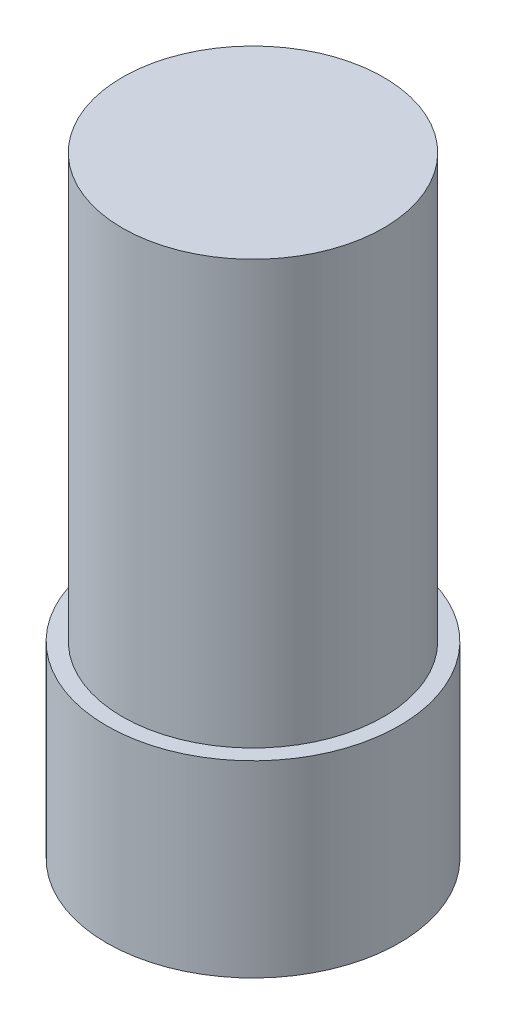
ISO-10303-21;
HEADER;
FILE_DESCRIPTION(('STEP AP214'),'2;1');
FILE_NAME('part.step','',(''),(''),'','','');
FILE_SCHEMA(('AUTOMOTIVE_DESIGN { 1 0 10303 214 1 1 1 1 }'));
ENDSEC;
DATA;
#1=APPLICATION_CONTEXT('core data for automotive mechanical design processes');
#2=APPLICATION_PROTOCOL_DEFINITION('international standard','automotive_design',2000,#1);
#3=PRODUCT_CONTEXT('',#1,'mechanical');
#4=PRODUCT('Part','Part','',(#3));
#5=PRODUCT_RELATED_PRODUCT_CATEGORY('part','',(#4));
#6=PRODUCT_DEFINITION_FORMATION('','',#4);
#7=PRODUCT_DEFINITION_CONTEXT('part definition',#1,'design');
#8=PRODUCT_DEFINITION('design','',#6,#7);
#9=PRODUCT_DEFINITION_SHAPE('','',#8);
#10=(LENGTH_UNIT() NAMED_UNIT(*) SI_UNIT(.MILLI.,.METRE.));
#11=(NAMED_UNIT(*) PLANE_ANGLE_UNIT() SI_UNIT($,.RADIAN.));
#12=(NAMED_UNIT(*) SI_UNIT($,.STERADIAN.) SOLID_ANGLE_UNIT());
#13=UNCERTAINTY_MEASURE_WITH_UNIT(LENGTH_MEASURE(1.E-05),#10,'distance_accuracy_value','');
#14=(GEOMETRIC_REPRESENTATION_CONTEXT(3) GLOBAL_UNCERTAINTY_ASSIGNED_CONTEXT((#13)) GLOBAL_UNIT_ASSIGNED_CONTEXT((#10,
#11,#12)) REPRESENTATION_CONTEXT('',''));
#15=CARTESIAN_POINT('',(0.,0.,0.));
#16=DIRECTION('',(0.,0.,1.));
#17=DIRECTION('',(1.,0.,0.));
#18=AXIS2_PLACEMENT_3D('',#15,#16,#17);
#19=CARTESIAN_POINT('',(0.,18.,0.));
#20=DIRECTION('',(0.,-1.,0.));
#21=DIRECTION('',(0.,0.,-1.));
#22=AXIS2_PLACEMENT_3D('',#19,#20,#21);
#23=CYLINDRICAL_SURFACE('',#22,14.);
#24=CARTESIAN_POINT('',(0.,18.,0.));
#25=DIRECTION('',(0.,1.,0.));
#26=DIRECTION('',(0.,0.,1.));
#27=AXIS2_PLACEMENT_3D('',#24,#25,#26);
#28=CIRCLE('',#27,14.);
#29=CARTESIAN_POINT('',(0.,18.,14.));
#30=VERTEX_POINT('',#29);
#31=EDGE_CURVE('E42',#30,#30,#28,.T.);
#32=ORIENTED_EDGE('',*,*,#31,.F.);
#33=EDGE_LOOP('',(#32));
#34=FACE_BOUND('',#33,.T.);
#35=CARTESIAN_POINT('',(0.,0.,0.));
#36=DIRECTION('',(0.,1.,0.));
#37=DIRECTION('',(0.,0.,1.));
#38=AXIS2_PLACEMENT_3D('',#35,#36,#37);
#39=CIRCLE('',#38,14.);
#40=CARTESIAN_POINT('',(0.,0.,14.));
#41=VERTEX_POINT('',#40);
#42=EDGE_CURVE('E38',#41,#41,#39,.T.);
#43=ORIENTED_EDGE('',*,*,#42,.T.);
#44=EDGE_LOOP('',(#43));
#45=FACE_BOUND('',#44,.T.);
#46=ADVANCED_FACE('F35',(#34,#45),#23,.T.);
#47=CARTESIAN_POINT('',(0.,18.,0.));
#48=DIRECTION('',(0.,1.,0.));
#49=DIRECTION('',(0.,0.,1.));
#50=AXIS2_PLACEMENT_3D('',#47,#48,#49);
#51=PLANE('',#50);
#52=CARTESIAN_POINT('',(0.,18.,0.));
#53=DIRECTION('',(0.,1.,0.));
#54=DIRECTION('',(0.,0.,1.));
#55=AXIS2_PLACEMENT_3D('',#52,#53,#54);
#56=CIRCLE('',#55,12.5);
#57=CARTESIAN_POINT('',(0.,18.,12.5));
#58=VERTEX_POINT('',#57);
#59=EDGE_CURVE('E10',#58,#58,#56,.T.);
#60=ORIENTED_EDGE('',*,*,#59,.F.);
#61=EDGE_LOOP('',(#60));
#62=FACE_BOUND('',#61,.T.);
#63=ORIENTED_EDGE('',*,*,#31,.T.);
#64=EDGE_LOOP('',(#63));
#65=FACE_BOUND('',#64,.T.);
#66=ADVANCED_FACE('F59',(#62,#65),#51,.T.);
#67=CARTESIAN_POINT('',(0.,0.,0.));
#68=DIRECTION('',(0.,1.,0.));
#69=DIRECTION('',(0.,0.,1.));
#70=AXIS2_PLACEMENT_3D('',#67,#68,#69);
#71=PLANE('',#70);
#72=ORIENTED_EDGE('',*,*,#42,.F.);
#73=EDGE_LOOP('',(#72));
#74=FACE_BOUND('',#73,.T.);
#75=ADVANCED_FACE('F56',(#74),#71,.F.);
#76=CARTESIAN_POINT('',(0.,58.5,0.));
#77=DIRECTION('',(0.,-1.,0.));
#78=DIRECTION('',(0.,0.,-1.));
#79=AXIS2_PLACEMENT_3D('',#76,#77,#78);
#80=CYLINDRICAL_SURFACE('',#79,12.5);
#81=CARTESIAN_POINT('',(0.,58.5,0.));
#82=DIRECTION('',(0.,1.,0.));
#83=DIRECTION('',(0.,0.,1.));
#84=AXIS2_PLACEMENT_3D('',#81,#82,#83);
#85=CIRCLE('',#84,12.5);
#86=CARTESIAN_POINT('',(0.,58.5,12.5));
#87=VERTEX_POINT('',#86);
#88=EDGE_CURVE('E48',#87,#87,#85,.T.);
#89=ORIENTED_EDGE('',*,*,#88,.F.);
#90=EDGE_LOOP('',(#89));
#91=FACE_BOUND('',#90,.T.);
#92=ORIENTED_EDGE('',*,*,#59,.T.);
#93=EDGE_LOOP('',(#92));
#94=FACE_BOUND('',#93,.T.);
#95=ADVANCED_FACE('F58',(#91,#94),#80,.T.);
#96=CARTESIAN_POINT('',(0.,58.5,0.));
#97=DIRECTION('',(0.,1.,0.));
#98=DIRECTION('',(0.,0.,1.));
#99=AXIS2_PLACEMENT_3D('',#96,#97,#98);
#100=PLANE('',#99);
#101=ORIENTED_EDGE('',*,*,#88,.T.);
#102=EDGE_LOOP('',(#101));
#103=FACE_BOUND('',#102,.T.);
#104=ADVANCED_FACE('F64',(#103),#100,.T.);
#105=CLOSED_SHELL('',(#46,#66,#75,#95,#104));
#106=MANIFOLD_SOLID_BREP('B2',#105);
#107=ADVANCED_BREP_SHAPE_REPRESENTATION('',(#18,#106),#14);
#108=SHAPE_DEFINITION_REPRESENTATION(#9,#107);
ENDSEC;
END-ISO-10303-21;
